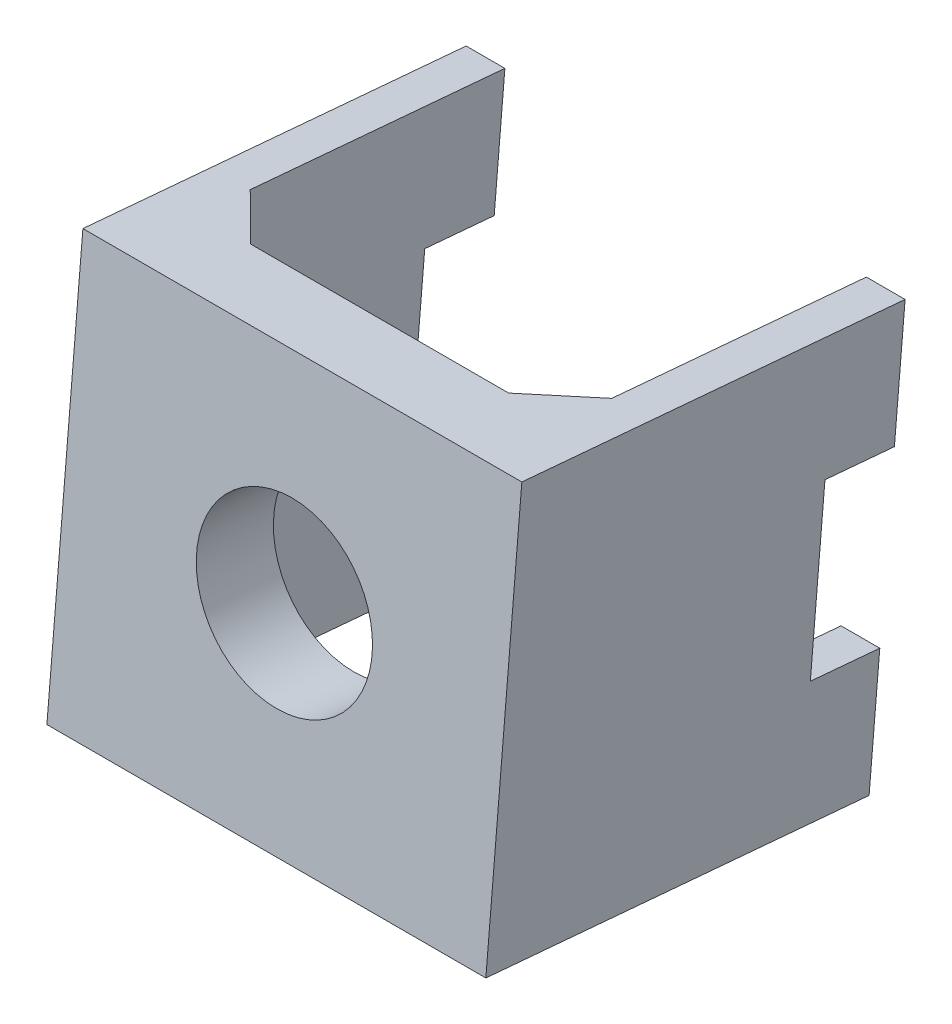
ISO-10303-21;
HEADER;
FILE_DESCRIPTION(('STEP AP214'),'2;1');
FILE_NAME('part.step','',(''),(''),'','','');
FILE_SCHEMA(('AUTOMOTIVE_DESIGN { 1 0 10303 214 1 1 1 1 }'));
ENDSEC;
DATA;
#1=APPLICATION_CONTEXT('core data for automotive mechanical design processes');
#2=APPLICATION_PROTOCOL_DEFINITION('international standard','automotive_design',2000,#1);
#3=PRODUCT_CONTEXT('',#1,'mechanical');
#4=PRODUCT('Part','Part','',(#3));
#5=PRODUCT_RELATED_PRODUCT_CATEGORY('part','',(#4));
#6=PRODUCT_DEFINITION_FORMATION('','',#4);
#7=PRODUCT_DEFINITION_CONTEXT('part definition',#1,'design');
#8=PRODUCT_DEFINITION('design','',#6,#7);
#9=PRODUCT_DEFINITION_SHAPE('','',#8);
#10=(LENGTH_UNIT() NAMED_UNIT(*) SI_UNIT(.MILLI.,.METRE.));
#11=(NAMED_UNIT(*) PLANE_ANGLE_UNIT() SI_UNIT($,.RADIAN.));
#12=(NAMED_UNIT(*) SI_UNIT($,.STERADIAN.) SOLID_ANGLE_UNIT());
#13=UNCERTAINTY_MEASURE_WITH_UNIT(LENGTH_MEASURE(1.E-05),#10,'distance_accuracy_value','');
#14=(GEOMETRIC_REPRESENTATION_CONTEXT(3) GLOBAL_UNCERTAINTY_ASSIGNED_CONTEXT((#13)) GLOBAL_UNIT_ASSIGNED_CONTEXT((#10,
#11,#12)) REPRESENTATION_CONTEXT('',''));
#15=CARTESIAN_POINT('',(0.,0.,0.));
#16=DIRECTION('',(0.,0.,1.));
#17=DIRECTION('',(1.,0.,0.));
#18=AXIS2_PLACEMENT_3D('',#15,#16,#17);
#19=CARTESIAN_POINT('',(0.,-0.771450948408242,-8.81772468932179));
#20=DIRECTION('',(0.,0.0871557427476508,0.996194698091746));
#21=DIRECTION('',(0.,-0.996194698091746,0.0871557427476508));
#22=AXIS2_PLACEMENT_3D('',#19,#20,#21);
#23=PLANE('',#22);
#24=DIRECTION('',(0.,-0.996194698091746,0.0871557427476508));
#25=VECTOR('',#24,1.);
#26=CARTESIAN_POINT('',(8.5,-50.7264702423465,-4.44722681488376));
#27=LINE('',#26,#25);
#28=CARTESIAN_POINT('',(8.5,-50.7264702423465,-4.44722681488376));
#29=VERTEX_POINT('',#28);
#30=CARTESIAN_POINT('',(8.50000000000001,-55.4583950582823,-4.03323703683242));
#31=VERTEX_POINT('',#30);
#32=EDGE_CURVE('E256',#29,#31,#27,.T.);
#33=ORIENTED_EDGE('',*,*,#32,.T.);
#34=DIRECTION('',(1.,0.,0.));
#35=VECTOR('',#34,1.);
#36=CARTESIAN_POINT('',(-16.1311755165637,-55.4583950582823,-4.03323703683242));
#37=LINE('',#36,#35);
#38=CARTESIAN_POINT('',(7.,-55.4583950582823,-4.03323703683242));
#39=VERTEX_POINT('',#38);
#40=EDGE_CURVE('E301',#39,#31,#37,.T.);
#41=ORIENTED_EDGE('',*,*,#40,.F.);
#42=DIRECTION('',(0.,-0.996194698091746,0.0871557427476507));
#43=VECTOR('',#42,1.);
#44=CARTESIAN_POINT('',(7.,-50.7264702423465,-4.44722681488377));
#45=LINE('',#44,#43);
#46=CARTESIAN_POINT('',(7.,-50.7264702423465,-4.44722681488376));
#47=VERTEX_POINT('',#46);
#48=EDGE_CURVE('E242',#47,#39,#45,.T.);
#49=ORIENTED_EDGE('',*,*,#48,.F.);
#50=DIRECTION('',(1.,0.,0.));
#51=VECTOR('',#50,1.);
#52=CARTESIAN_POINT('',(0.,-50.7264702423465,-4.44722681488376));
#53=LINE('',#52,#51);
#54=EDGE_CURVE('E259',#47,#29,#53,.T.);
#55=ORIENTED_EDGE('',*,*,#54,.T.);
#56=EDGE_LOOP('',(#33,#41,#49,#55));
#57=FACE_BOUND('',#56,.T.);
#58=ADVANCED_FACE('F43',(#57),#23,.F.);
#59=CARTESIAN_POINT('',(0.,-0.771450948408242,-8.81772468932179));
#60=DIRECTION('',(0.,0.0871557427476508,0.996194698091746));
#61=DIRECTION('',(0.,-0.996194698091746,0.0871557427476508));
#62=AXIS2_PLACEMENT_3D('',#59,#60,#61);
#63=PLANE('',#62);
#64=DIRECTION('',(0.,-0.996194698091746,0.0871557427476507));
#65=VECTOR('',#64,1.);
#66=CARTESIAN_POINT('',(-7.,-50.7264702423465,-4.44722681488377));
#67=LINE('',#66,#65);
#68=CARTESIAN_POINT('',(-7.,-50.7264702423465,-4.44722681488376));
#69=VERTEX_POINT('',#68);
#70=CARTESIAN_POINT('',(-7.,-55.4583950582823,-4.03323703683242));
#71=VERTEX_POINT('',#70);
#72=EDGE_CURVE('E201',#69,#71,#67,.T.);
#73=ORIENTED_EDGE('',*,*,#72,.T.);
#74=CARTESIAN_POINT('',(-8.50000000000001,-55.4583950582823,-4.03323703683242));
#75=VERTEX_POINT('',#74);
#76=EDGE_CURVE('E176',#75,#71,#37,.T.);
#77=ORIENTED_EDGE('',*,*,#76,.F.);
#78=DIRECTION('',(0.,-0.996194698091746,0.0871557427476508));
#79=VECTOR('',#78,1.);
#80=CARTESIAN_POINT('',(-8.5,-50.7264702423465,-4.44722681488376));
#81=LINE('',#80,#79);
#82=CARTESIAN_POINT('',(-8.5,-50.7264702423465,-4.44722681488376));
#83=VERTEX_POINT('',#82);
#84=EDGE_CURVE('E188',#83,#75,#81,.T.);
#85=ORIENTED_EDGE('',*,*,#84,.F.);
#86=DIRECTION('',(-1.,0.,0.));
#87=VECTOR('',#86,1.);
#88=CARTESIAN_POINT('',(0.,-50.7264702423465,-4.44722681488376));
#89=LINE('',#88,#87);
#90=EDGE_CURVE('E212',#69,#83,#89,.T.);
#91=ORIENTED_EDGE('',*,*,#90,.F.);
#92=EDGE_LOOP('',(#73,#77,#85,#91));
#93=FACE_BOUND('',#92,.T.);
#94=ADVANCED_FACE('F347',(#93),#63,.F.);
#95=CARTESIAN_POINT('',(0.,-52.3142448835567,-22.5955740089158));
#96=DIRECTION('',(0.,0.996194698091746,-0.0871557427476508));
#97=DIRECTION('',(0.,0.0871557427476508,0.996194698091746));
#98=AXIS2_PLACEMENT_3D('',#95,#96,#97);
#99=PLANE('',#98);
#100=DIRECTION('',(1.,0.,0.));
#101=VECTOR('',#100,1.);
#102=CARTESIAN_POINT('',(7.,-49.6893169036494,7.40749009240801));
#103=LINE('',#102,#101);
#104=CARTESIAN_POINT('',(-4.99999999999997,-49.6893169036494,7.40749009240801));
#105=VERTEX_POINT('',#104);
#106=CARTESIAN_POINT('',(4.99999999999997,-49.6893169036494,7.40749009240801));
#107=VERTEX_POINT('',#106);
#108=EDGE_CURVE('E247',#105,#107,#103,.T.);
#109=ORIENTED_EDGE('',*,*,#108,.F.);
#110=DIRECTION('',(-0.707106781186551,-0.0616284167162138,-0.704416026402755));
#111=VECTOR('',#110,1.);
#112=CARTESIAN_POINT('',(-4.99999999999997,-49.6893169036495,7.40749009240802));
#113=LINE('',#112,#111);
#114=CARTESIAN_POINT('',(-7.,-49.8636283891447,5.41510069622452));
#115=VERTEX_POINT('',#114);
#116=EDGE_CURVE('E235',#115,#105,#113,.F.);
#117=ORIENTED_EDGE('',*,*,#116,.F.);
#118=DIRECTION('',(0.,-0.0871557427476507,-0.996194698091746));
#119=VECTOR('',#118,1.);
#120=CARTESIAN_POINT('',(-7.,-47.9057400651491,27.7938666424623));
#121=LINE('',#120,#119);
#122=EDGE_CURVE('E204',#115,#69,#121,.T.);
#123=ORIENTED_EDGE('',*,*,#122,.T.);
#124=ORIENTED_EDGE('',*,*,#90,.T.);
#125=DIRECTION('',(0.,0.0871557427476508,0.996194698091746));
#126=VECTOR('',#125,1.);
#127=CARTESIAN_POINT('',(-8.5,-52.3142448835567,-22.5955740089158));
#128=LINE('',#127,#126);
#129=CARTESIAN_POINT('',(-8.5,-49.4278496754065,10.3960741866833));
#130=VERTEX_POINT('',#129);
#131=EDGE_CURVE('E220',#83,#130,#128,.T.);
#132=ORIENTED_EDGE('',*,*,#131,.T.);
#133=DIRECTION('',(-1.,0.,0.));
#134=VECTOR('',#133,1.);
#135=CARTESIAN_POINT('',(0.,-49.4278496754065,10.3960741866833));
#136=LINE('',#135,#134);
#137=CARTESIAN_POINT('',(8.5,-49.4278496754065,10.3960741866833));
#138=VERTEX_POINT('',#137);
#139=EDGE_CURVE('E268',#138,#130,#136,.T.);
#140=ORIENTED_EDGE('',*,*,#139,.F.);
#141=DIRECTION('',(0.,0.0871557427476508,0.996194698091746));
#142=VECTOR('',#141,1.);
#143=CARTESIAN_POINT('',(8.5,-52.3142448835567,-22.5955740089158));
#144=LINE('',#143,#142);
#145=EDGE_CURVE('E271',#29,#138,#144,.T.);
#146=ORIENTED_EDGE('',*,*,#145,.F.);
#147=ORIENTED_EDGE('',*,*,#54,.F.);
#148=DIRECTION('',(0.,-0.0871557427476507,-0.996194698091746));
#149=VECTOR('',#148,1.);
#150=CARTESIAN_POINT('',(7.,-47.9057400651491,27.7938666424623));
#151=LINE('',#150,#149);
#152=CARTESIAN_POINT('',(7.,-49.8636283891447,5.41510069622452));
#153=VERTEX_POINT('',#152);
#154=EDGE_CURVE('E250',#153,#47,#151,.T.);
#155=ORIENTED_EDGE('',*,*,#154,.F.);
#156=DIRECTION('',(0.707106781186551,-0.0616284167162138,-0.704416026402755));
#157=VECTOR('',#156,1.);
#158=CARTESIAN_POINT('',(4.99999999999997,-49.6893169036495,7.40749009240802));
#159=LINE('',#158,#157);
#160=EDGE_CURVE('E286',#153,#107,#159,.F.);
#161=ORIENTED_EDGE('',*,*,#160,.T.);
#162=EDGE_LOOP('',(#109,#117,#123,#124,#132,#140,#146,#147,#155,#161));
#163=FACE_BOUND('',#162,.T.);
#164=ADVANCED_FACE('F335',(#163),#99,.T.);
#165=CARTESIAN_POINT('',(8.5,-52.3142448835567,-22.5955740089158));
#166=DIRECTION('',(1.,0.,0.));
#167=DIRECTION('',(0.,1.,0.));
#168=AXIS2_PLACEMENT_3D('',#165,#166,#167);
#169=PLANE('',#168);
#170=DIRECTION('',(0.,0.0871557427476503,0.996194698091746));
#171=VECTOR('',#170,1.);
#172=CARTESIAN_POINT('',(8.5,-57.0461696994925,-22.1815842308644));
#173=LINE('',#172,#171);
#174=CARTESIAN_POINT('',(8.5,-55.2230745528637,-1.34351135198471));
#175=VERTEX_POINT('',#174);
#176=EDGE_CURVE('E193',#31,#175,#173,.T.);
#177=ORIENTED_EDGE('',*,*,#176,.F.);
#178=ORIENTED_EDGE('',*,*,#32,.F.);
#179=ORIENTED_EDGE('',*,*,#145,.T.);
#180=DIRECTION('',(0.,0.996194698091746,-0.0871557427476507));
#181=VECTOR('',#180,1.);
#182=CARTESIAN_POINT('',(8.5,-49.4278496754065,10.3960741866833));
#183=LINE('',#182,#181);
#184=CARTESIAN_POINT('',(8.50000000000001,-65.3669648448745,11.7905660706457));
#185=VERTEX_POINT('',#184);
#186=EDGE_CURVE('E265',#185,#138,#183,.T.);
#187=ORIENTED_EDGE('',*,*,#186,.F.);
#188=DIRECTION('',(0.,0.0871557427476508,0.996194698091746));
#189=VECTOR('',#188,1.);
#190=CARTESIAN_POINT('',(8.50000000000001,-68.2533600530247,-21.2010821249533));
#191=LINE('',#190,#189);
#192=CARTESIAN_POINT('',(8.50000000000001,-66.6655854118145,-3.05273493092135));
#193=VERTEX_POINT('',#192);
#194=EDGE_CURVE('E270',#193,#185,#191,.T.);
#195=ORIENTED_EDGE('',*,*,#194,.F.);
#196=CARTESIAN_POINT('',(8.5,-61.9336605958787,-3.46672470897269));
#197=VERTEX_POINT('',#196);
#198=EDGE_CURVE('E260',#197,#193,#27,.T.);
#199=ORIENTED_EDGE('',*,*,#198,.F.);
#200=DIRECTION('',(0.,-0.0871557427476503,-0.996194698091746));
#201=VECTOR('',#200,1.);
#202=CARTESIAN_POINT('',(8.50000000000001,-63.5214352370888,-21.6150719030047));
#203=LINE('',#202,#201);
#204=CARTESIAN_POINT('',(8.5,-61.69834009046,-0.776999024124979));
#205=VERTEX_POINT('',#204);
#206=EDGE_CURVE('E190',#205,#197,#203,.T.);
#207=ORIENTED_EDGE('',*,*,#206,.F.);
#208=DIRECTION('',(0.,-0.996194698091746,0.0871557427476507));
#209=VECTOR('',#208,1.);
#210=CARTESIAN_POINT('',(8.5,-50.4911497369279,-1.75750113003605));
#211=LINE('',#210,#209);
#212=EDGE_CURVE('E311',#175,#205,#211,.T.);
#213=ORIENTED_EDGE('',*,*,#212,.F.);
#214=EDGE_LOOP('',(#177,#178,#179,#187,#195,#199,#207,#213));
#215=FACE_BOUND('',#214,.T.);
#216=ADVANCED_FACE('F356',(#215),#169,.T.);
#217=CARTESIAN_POINT('',(0.,-68.2533600530247,-21.2010821249533));
#218=DIRECTION('',(0.,-0.996194698091746,0.0871557427476508));
#219=DIRECTION('',(0.,-0.0871557427476508,-0.996194698091746));
#220=AXIS2_PLACEMENT_3D('',#217,#218,#219);
#221=PLANE('',#220);
#222=DIRECTION('',(-1.,0.,0.));
#223=VECTOR('',#222,1.);
#224=CARTESIAN_POINT('',(6.99999999999999,-65.6284320731174,8.80198197637043));
#225=LINE('',#224,#223);
#226=CARTESIAN_POINT('',(4.99999999999997,-65.6284320731174,8.80198197637043));
#227=VERTEX_POINT('',#226);
#228=CARTESIAN_POINT('',(-4.99999999999997,-65.6284320731174,8.80198197637043));
#229=VERTEX_POINT('',#228);
#230=EDGE_CURVE('E245',#227,#229,#225,.T.);
#231=ORIENTED_EDGE('',*,*,#230,.F.);
#232=DIRECTION('',(-0.707106781186551,0.0616284167162138,0.704416026402755));
#233=VECTOR('',#232,1.);
#234=CARTESIAN_POINT('',(4.99999999999997,-65.6284320731174,8.80198197637043));
#235=LINE('',#234,#233);
#236=CARTESIAN_POINT('',(6.99999999999999,-65.8027435586127,6.80959258018694));
#237=VERTEX_POINT('',#236);
#238=EDGE_CURVE('E284',#227,#237,#235,.F.);
#239=ORIENTED_EDGE('',*,*,#238,.T.);
#240=DIRECTION('',(0.,-0.0871557427476507,-0.996194698091746));
#241=VECTOR('',#240,1.);
#242=CARTESIAN_POINT('',(6.99999999999999,-63.8448552346171,29.1883585264247));
#243=LINE('',#242,#241);
#244=CARTESIAN_POINT('',(6.99999999999999,-66.6655854118144,-3.05273493092136));
#245=VERTEX_POINT('',#244);
#246=EDGE_CURVE('E252',#237,#245,#243,.T.);
#247=ORIENTED_EDGE('',*,*,#246,.T.);
#248=DIRECTION('',(-1.,0.,0.));
#249=VECTOR('',#248,1.);
#250=CARTESIAN_POINT('',(0.,-66.6655854118145,-3.05273493092135));
#251=LINE('',#250,#249);
#252=EDGE_CURVE('E262',#193,#245,#251,.T.);
#253=ORIENTED_EDGE('',*,*,#252,.F.);
#254=ORIENTED_EDGE('',*,*,#194,.T.);
#255=DIRECTION('',(1.,0.,0.));
#256=VECTOR('',#255,1.);
#257=CARTESIAN_POINT('',(0.,-65.3669648448745,11.7905660706457));
#258=LINE('',#257,#256);
#259=CARTESIAN_POINT('',(-8.50000000000001,-65.3669648448745,11.7905660706457));
#260=VERTEX_POINT('',#259);
#261=EDGE_CURVE('E255',#260,#185,#258,.T.);
#262=ORIENTED_EDGE('',*,*,#261,.F.);
#263=DIRECTION('',(0.,0.0871557427476508,0.996194698091746));
#264=VECTOR('',#263,1.);
#265=CARTESIAN_POINT('',(-8.50000000000001,-68.2533600530247,-21.2010821249533));
#266=LINE('',#265,#264);
#267=CARTESIAN_POINT('',(-8.50000000000001,-66.6655854118145,-3.05273493092135));
#268=VERTEX_POINT('',#267);
#269=EDGE_CURVE('E219',#268,#260,#266,.T.);
#270=ORIENTED_EDGE('',*,*,#269,.F.);
#271=DIRECTION('',(1.,0.,0.));
#272=VECTOR('',#271,1.);
#273=CARTESIAN_POINT('',(0.,-66.6655854118145,-3.05273493092135));
#274=LINE('',#273,#272);
#275=CARTESIAN_POINT('',(-6.99999999999999,-66.6655854118144,-3.05273493092136));
#276=VERTEX_POINT('',#275);
#277=EDGE_CURVE('E216',#268,#276,#274,.T.);
#278=ORIENTED_EDGE('',*,*,#277,.T.);
#279=DIRECTION('',(0.,-0.0871557427476507,-0.996194698091746));
#280=VECTOR('',#279,1.);
#281=CARTESIAN_POINT('',(-6.99999999999999,-63.8448552346171,29.1883585264247));
#282=LINE('',#281,#280);
#283=CARTESIAN_POINT('',(-6.99999999999999,-65.8027435586127,6.80959258018694));
#284=VERTEX_POINT('',#283);
#285=EDGE_CURVE('E207',#284,#276,#282,.T.);
#286=ORIENTED_EDGE('',*,*,#285,.F.);
#287=DIRECTION('',(0.707106781186551,0.0616284167162138,0.704416026402755));
#288=VECTOR('',#287,1.);
#289=CARTESIAN_POINT('',(-4.99999999999997,-65.6284320731174,8.80198197637043));
#290=LINE('',#289,#288);
#291=EDGE_CURVE('E232',#229,#284,#290,.F.);
#292=ORIENTED_EDGE('',*,*,#291,.F.);
#293=EDGE_LOOP('',(#231,#239,#247,#253,#254,#262,#270,#278,#286,#292));
#294=FACE_BOUND('',#293,.T.);
#295=ADVANCED_FACE('F327',(#294),#221,.T.);
#296=CARTESIAN_POINT('',(0.,0.527169618531755,6.02557631224522));
#297=DIRECTION('',(0.,0.0871557427476507,0.996194698091746));
#298=DIRECTION('',(0.,-0.996194698091746,0.0871557427476507));
#299=AXIS2_PLACEMENT_3D('',#296,#297,#298);
#300=PLANE('',#299);
#301=DIRECTION('',(0.,0.996194698091746,-0.0871557427476507));
#302=VECTOR('',#301,1.);
#303=CARTESIAN_POINT('',(-8.5,-49.4278496754065,10.3960741866833));
#304=LINE('',#303,#302);
#305=EDGE_CURVE('E210',#260,#130,#304,.T.);
#306=ORIENTED_EDGE('',*,*,#305,.F.);
#307=ORIENTED_EDGE('',*,*,#261,.T.);
#308=ORIENTED_EDGE('',*,*,#186,.T.);
#309=ORIENTED_EDGE('',*,*,#139,.T.);
#310=EDGE_LOOP('',(#306,#307,#308,#309));
#311=FACE_BOUND('',#310,.T.);
#312=CARTESIAN_POINT('',(0.,-57.3974072601404,11.0933201286645));
#313=DIRECTION('',(0.,0.0871557427476508,0.996194698091746));
#314=DIRECTION('',(0.,-0.996194698091746,0.0871557427476508));
#315=AXIS2_PLACEMENT_3D('',#312,#313,#314);
#316=CIRCLE('',#315,3.4);
#317=CARTESIAN_POINT('',(0.,-60.7844692336524,11.3896496540065));
#318=VERTEX_POINT('',#317);
#319=EDGE_CURVE('E238',#318,#318,#316,.T.);
#320=ORIENTED_EDGE('',*,*,#319,.F.);
#321=EDGE_LOOP('',(#320));
#322=FACE_BOUND('',#321,.T.);
#323=ADVANCED_FACE('F352',(#311,#322),#300,.T.);
#324=CARTESIAN_POINT('',(7.,-61.9336605958787,-3.46672470897269));
#325=VERTEX_POINT('',#324);
#326=EDGE_CURVE('E241',#325,#245,#45,.T.);
#327=ORIENTED_EDGE('',*,*,#326,.F.);
#328=DIRECTION('',(1.,0.,0.));
#329=VECTOR('',#328,1.);
#330=CARTESIAN_POINT('',(-16.1311755165637,-61.9336605958787,-3.46672470897269));
#331=LINE('',#330,#329);
#332=EDGE_CURVE('E302',#325,#197,#331,.T.);
#333=ORIENTED_EDGE('',*,*,#332,.T.);
#334=ORIENTED_EDGE('',*,*,#198,.T.);
#335=ORIENTED_EDGE('',*,*,#252,.T.);
#336=EDGE_LOOP('',(#327,#333,#334,#335));
#337=FACE_BOUND('',#336,.T.);
#338=ADVANCED_FACE('F321',(#337),#23,.F.);
#339=CARTESIAN_POINT('',(0.,0.265702390288803,3.03699221796999));
#340=DIRECTION('',(0.,0.0871557427476507,0.996194698091746));
#341=DIRECTION('',(0.,-0.996194698091746,0.0871557427476507));
#342=AXIS2_PLACEMENT_3D('',#339,#340,#341);
#343=PLANE('',#342);
#344=CARTESIAN_POINT('',(0.,-57.6588744883834,8.10473603438922));
#345=DIRECTION('',(0.,0.0871557427476507,0.996194698091746));
#346=DIRECTION('',(0.,-0.996194698091746,0.0871557427476507));
#347=AXIS2_PLACEMENT_3D('',#344,#345,#346);
#348=CIRCLE('',#347,3.4);
#349=CARTESIAN_POINT('',(0.,-61.0459364618953,8.40106555973123));
#350=VERTEX_POINT('',#349);
#351=EDGE_CURVE('E276',#350,#350,#348,.T.);
#352=ORIENTED_EDGE('',*,*,#351,.T.);
#353=EDGE_LOOP('',(#352));
#354=FACE_BOUND('',#353,.T.);
#355=ORIENTED_EDGE('',*,*,#108,.T.);
#356=DIRECTION('',(0.,-0.996194698091746,0.0871557427476507));
#357=VECTOR('',#356,1.);
#358=CARTESIAN_POINT('',(4.99999999999997,-65.6284320731174,8.80198197637043));
#359=LINE('',#358,#357);
#360=EDGE_CURVE('E279',#107,#227,#359,.T.);
#361=ORIENTED_EDGE('',*,*,#360,.T.);
#362=ORIENTED_EDGE('',*,*,#230,.T.);
#363=DIRECTION('',(0.,-0.996194698091746,0.0871557427476507));
#364=VECTOR('',#363,1.);
#365=CARTESIAN_POINT('',(-4.99999999999997,-65.6284320731174,8.80198197637043));
#366=LINE('',#365,#364);
#367=EDGE_CURVE('E227',#105,#229,#366,.T.);
#368=ORIENTED_EDGE('',*,*,#367,.F.);
#369=EDGE_LOOP('',(#355,#361,#362,#368));
#370=FACE_BOUND('',#369,.T.);
#371=ADVANCED_FACE('F340',(#354,#370),#343,.F.);
#372=CARTESIAN_POINT('',(7.,-47.9057400651491,27.7938666424623));
#373=DIRECTION('',(1.,0.,0.));
#374=DIRECTION('',(0.,1.,0.));
#375=AXIS2_PLACEMENT_3D('',#372,#373,#374);
#376=PLANE('',#375);
#377=ORIENTED_EDGE('',*,*,#48,.T.);
#378=DIRECTION('',(0.,0.0871557427476503,0.996194698091746));
#379=VECTOR('',#378,1.);
#380=CARTESIAN_POINT('',(7.,-52.637664881085,28.2078564205136));
#381=LINE('',#380,#379);
#382=CARTESIAN_POINT('',(7.,-55.2230745528637,-1.34351135198471));
#383=VERTEX_POINT('',#382);
#384=EDGE_CURVE('E189',#39,#383,#381,.T.);
#385=ORIENTED_EDGE('',*,*,#384,.T.);
#386=DIRECTION('',(0.,-0.996194698091746,0.0871557427476507));
#387=VECTOR('',#386,1.);
#388=CARTESIAN_POINT('',(7.,-50.4911497369278,-1.75750113003605));
#389=LINE('',#388,#387);
#390=CARTESIAN_POINT('',(7.,-61.69834009046,-0.776999024124979));
#391=VERTEX_POINT('',#390);
#392=EDGE_CURVE('E175',#383,#391,#389,.T.);
#393=ORIENTED_EDGE('',*,*,#392,.T.);
#394=DIRECTION('',(0.,-0.0871557427476503,-0.996194698091746));
#395=VECTOR('',#394,1.);
#396=CARTESIAN_POINT('',(7.,-59.1129304186813,28.7743687483734));
#397=LINE('',#396,#395);
#398=EDGE_CURVE('E195',#391,#325,#397,.T.);
#399=ORIENTED_EDGE('',*,*,#398,.T.);
#400=ORIENTED_EDGE('',*,*,#326,.T.);
#401=ORIENTED_EDGE('',*,*,#246,.F.);
#402=DIRECTION('',(0.,0.996194698091746,-0.0871557427476507));
#403=VECTOR('',#402,1.);
#404=CARTESIAN_POINT('',(7.,-49.8636283891447,5.41510069622452));
#405=LINE('',#404,#403);
#406=EDGE_CURVE('E282',#237,#153,#405,.T.);
#407=ORIENTED_EDGE('',*,*,#406,.T.);
#408=ORIENTED_EDGE('',*,*,#154,.T.);
#409=EDGE_LOOP('',(#377,#385,#393,#399,#400,#401,#407,#408));
#410=FACE_BOUND('',#409,.T.);
#411=ADVANCED_FACE('F317',(#410),#376,.F.);
#412=CARTESIAN_POINT('',(0.,-62.8490618065024,-51.2193764728454));
#413=DIRECTION('',(0.,0.0871557427476508,0.996194698091746));
#414=DIRECTION('',(0.,-0.996194698091746,0.0871557427476508));
#415=AXIS2_PLACEMENT_3D('',#412,#413,#414);
#416=CYLINDRICAL_SURFACE('',#415,3.4);
#417=ORIENTED_EDGE('',*,*,#319,.T.);
#418=EDGE_LOOP('',(#417));
#419=FACE_BOUND('',#418,.T.);
#420=ORIENTED_EDGE('',*,*,#351,.F.);
#421=EDGE_LOOP('',(#420));
#422=FACE_BOUND('',#421,.T.);
#423=ADVANCED_FACE('F506',(#419,#422),#416,.F.);
#424=CARTESIAN_POINT('',(4.99999999999998,0.265702390288802,3.03699221796999));
#425=DIRECTION('',(-0.707106781186544,-0.0616284167162143,-0.704416026402763));
#426=DIRECTION('',(0.,0.996194698091746,-0.0871557427476507));
#427=AXIS2_PLACEMENT_3D('',#424,#425,#426);
#428=PLANE('',#427);
#429=ORIENTED_EDGE('',*,*,#160,.F.);
#430=ORIENTED_EDGE('',*,*,#406,.F.);
#431=ORIENTED_EDGE('',*,*,#238,.F.);
#432=ORIENTED_EDGE('',*,*,#360,.F.);
#433=EDGE_LOOP('',(#429,#430,#431,#432));
#434=FACE_BOUND('',#433,.T.);
#435=ADVANCED_FACE('F46',(#434),#428,.T.);
#436=CARTESIAN_POINT('',(-8.5,-52.3142448835567,-22.5955740089158));
#437=DIRECTION('',(-1.,0.,0.));
#438=DIRECTION('',(0.,1.,0.));
#439=AXIS2_PLACEMENT_3D('',#436,#437,#438);
#440=PLANE('',#439);
#441=DIRECTION('',(0.,-0.0871557427476503,-0.996194698091746));
#442=VECTOR('',#441,1.);
#443=CARTESIAN_POINT('',(-8.5,-57.0461696994925,-22.1815842308644));
#444=LINE('',#443,#442);
#445=CARTESIAN_POINT('',(-8.5,-55.2230745528637,-1.34351135198471));
#446=VERTEX_POINT('',#445);
#447=EDGE_CURVE('E180',#446,#75,#444,.T.);
#448=ORIENTED_EDGE('',*,*,#447,.F.);
#449=DIRECTION('',(0.,0.996194698091746,-0.0871557427476507));
#450=VECTOR('',#449,1.);
#451=CARTESIAN_POINT('',(-8.5,-50.4911497369279,-1.75750113003605));
#452=LINE('',#451,#450);
#453=CARTESIAN_POINT('',(-8.5,-61.69834009046,-0.776999024124979));
#454=VERTEX_POINT('',#453);
#455=EDGE_CURVE('E168',#454,#446,#452,.T.);
#456=ORIENTED_EDGE('',*,*,#455,.F.);
#457=DIRECTION('',(0.,0.0871557427476503,0.996194698091746));
#458=VECTOR('',#457,1.);
#459=CARTESIAN_POINT('',(-8.50000000000001,-63.5214352370888,-21.6150719030047));
#460=LINE('',#459,#458);
#461=CARTESIAN_POINT('',(-8.50000000000001,-61.9336605958787,-3.46672470897269));
#462=VERTEX_POINT('',#461);
#463=EDGE_CURVE('E313',#462,#454,#460,.T.);
#464=ORIENTED_EDGE('',*,*,#463,.F.);
#465=EDGE_CURVE('E213',#462,#268,#81,.T.);
#466=ORIENTED_EDGE('',*,*,#465,.T.);
#467=ORIENTED_EDGE('',*,*,#269,.T.);
#468=ORIENTED_EDGE('',*,*,#305,.T.);
#469=ORIENTED_EDGE('',*,*,#131,.F.);
#470=ORIENTED_EDGE('',*,*,#84,.T.);
#471=EDGE_LOOP('',(#448,#456,#464,#466,#467,#468,#469,#470));
#472=FACE_BOUND('',#471,.T.);
#473=ADVANCED_FACE('F186',(#472),#440,.T.);
#474=ORIENTED_EDGE('',*,*,#465,.F.);
#475=CARTESIAN_POINT('',(-7.,-61.9336605958787,-3.46672470897269));
#476=VERTEX_POINT('',#475);
#477=EDGE_CURVE('E296',#462,#476,#331,.T.);
#478=ORIENTED_EDGE('',*,*,#477,.T.);
#479=EDGE_CURVE('E200',#476,#276,#67,.T.);
#480=ORIENTED_EDGE('',*,*,#479,.T.);
#481=ORIENTED_EDGE('',*,*,#277,.F.);
#482=EDGE_LOOP('',(#474,#478,#480,#481));
#483=FACE_BOUND('',#482,.T.);
#484=ADVANCED_FACE('F299',(#483),#63,.F.);
#485=CARTESIAN_POINT('',(-7.,-47.9057400651491,27.7938666424623));
#486=DIRECTION('',(-1.,0.,0.));
#487=DIRECTION('',(0.,1.,0.));
#488=AXIS2_PLACEMENT_3D('',#485,#486,#487);
#489=PLANE('',#488);
#490=DIRECTION('',(0.,0.996194698091746,-0.0871557427476507));
#491=VECTOR('',#490,1.);
#492=CARTESIAN_POINT('',(-7.,-50.4911497369278,-1.75750113003605));
#493=LINE('',#492,#491);
#494=CARTESIAN_POINT('',(-7.,-61.69834009046,-0.776999024124979));
#495=VERTEX_POINT('',#494);
#496=CARTESIAN_POINT('',(-7.,-55.2230745528637,-1.34351135198471));
#497=VERTEX_POINT('',#496);
#498=EDGE_CURVE('E288',#495,#497,#493,.T.);
#499=ORIENTED_EDGE('',*,*,#498,.T.);
#500=DIRECTION('',(0.,-0.0871557427476503,-0.996194698091746));
#501=VECTOR('',#500,1.);
#502=CARTESIAN_POINT('',(-7.,-52.637664881085,28.2078564205136));
#503=LINE('',#502,#501);
#504=EDGE_CURVE('E12',#497,#71,#503,.T.);
#505=ORIENTED_EDGE('',*,*,#504,.T.);
#506=ORIENTED_EDGE('',*,*,#72,.F.);
#507=ORIENTED_EDGE('',*,*,#122,.F.);
#508=DIRECTION('',(0.,0.996194698091746,-0.0871557427476507));
#509=VECTOR('',#508,1.);
#510=CARTESIAN_POINT('',(-7.,-49.8636283891447,5.41510069622452));
#511=LINE('',#510,#509);
#512=EDGE_CURVE('E230',#284,#115,#511,.T.);
#513=ORIENTED_EDGE('',*,*,#512,.F.);
#514=ORIENTED_EDGE('',*,*,#285,.T.);
#515=ORIENTED_EDGE('',*,*,#479,.F.);
#516=DIRECTION('',(0.,0.0871557427476503,0.996194698091746));
#517=VECTOR('',#516,1.);
#518=CARTESIAN_POINT('',(-7.,-59.1129304186813,28.7743687483734));
#519=LINE('',#518,#517);
#520=EDGE_CURVE('E52',#476,#495,#519,.T.);
#521=ORIENTED_EDGE('',*,*,#520,.T.);
#522=EDGE_LOOP('',(#499,#505,#506,#507,#513,#514,#515,#521));
#523=FACE_BOUND('',#522,.T.);
#524=ADVANCED_FACE('F292',(#523),#489,.F.);
#525=CARTESIAN_POINT('',(-4.99999999999998,0.265702390288802,3.03699221796999));
#526=DIRECTION('',(0.707106781186544,-0.0616284167162143,-0.704416026402763));
#527=DIRECTION('',(0.,0.996194698091746,-0.0871557427476507));
#528=AXIS2_PLACEMENT_3D('',#525,#526,#527);
#529=PLANE('',#528);
#530=ORIENTED_EDGE('',*,*,#116,.T.);
#531=ORIENTED_EDGE('',*,*,#367,.T.);
#532=ORIENTED_EDGE('',*,*,#291,.T.);
#533=ORIENTED_EDGE('',*,*,#512,.T.);
#534=EDGE_LOOP('',(#530,#531,#532,#533));
#535=FACE_BOUND('',#534,.T.);
#536=ADVANCED_FACE('F343',(#535),#529,.T.);
#537=CARTESIAN_POINT('',(-16.1311755165637,-55.2230745528637,-1.34351135198471));
#538=DIRECTION('',(0.,0.0871557427476507,0.996194698091746));
#539=DIRECTION('',(0.,-0.996194698091746,0.0871557427476507));
#540=AXIS2_PLACEMENT_3D('',#537,#538,#539);
#541=PLANE('',#540);
#542=ORIENTED_EDGE('',*,*,#455,.T.);
#543=DIRECTION('',(1.,0.,0.));
#544=VECTOR('',#543,1.);
#545=CARTESIAN_POINT('',(-16.1311755165637,-55.2230745528637,-1.34351135198471));
#546=LINE('',#545,#544);
#547=EDGE_CURVE('E67',#446,#497,#546,.T.);
#548=ORIENTED_EDGE('',*,*,#547,.T.);
#549=ORIENTED_EDGE('',*,*,#498,.F.);
#550=DIRECTION('',(1.,0.,0.));
#551=VECTOR('',#550,1.);
#552=CARTESIAN_POINT('',(-16.1311755165637,-61.69834009046,-0.776999024124979));
#553=LINE('',#552,#551);
#554=EDGE_CURVE('E171',#454,#495,#553,.T.);
#555=ORIENTED_EDGE('',*,*,#554,.F.);
#556=EDGE_LOOP('',(#542,#548,#549,#555));
#557=FACE_BOUND('',#556,.T.);
#558=ADVANCED_FACE('F169',(#557),#541,.F.);
#559=CARTESIAN_POINT('',(-16.1311755165637,-61.69834009046,-0.776999024124979));
#560=DIRECTION('',(0.,-0.996194698091746,0.0871557427476503));
#561=DIRECTION('',(0.,-0.0871557427476503,-0.996194698091746));
#562=AXIS2_PLACEMENT_3D('',#559,#560,#561);
#563=PLANE('',#562);
#564=ORIENTED_EDGE('',*,*,#463,.T.);
#565=ORIENTED_EDGE('',*,*,#554,.T.);
#566=ORIENTED_EDGE('',*,*,#520,.F.);
#567=ORIENTED_EDGE('',*,*,#477,.F.);
#568=EDGE_LOOP('',(#564,#565,#566,#567));
#569=FACE_BOUND('',#568,.T.);
#570=ADVANCED_FACE('F295',(#569),#563,.F.);
#571=CARTESIAN_POINT('',(-16.1311755165637,-55.4583950582823,-4.03323703683242));
#572=DIRECTION('',(0.,0.996194698091746,-0.0871557427476503));
#573=DIRECTION('',(0.,0.0871557427476503,0.996194698091746));
#574=AXIS2_PLACEMENT_3D('',#571,#572,#573);
#575=PLANE('',#574);
#576=ORIENTED_EDGE('',*,*,#447,.T.);
#577=ORIENTED_EDGE('',*,*,#76,.T.);
#578=ORIENTED_EDGE('',*,*,#504,.F.);
#579=ORIENTED_EDGE('',*,*,#547,.F.);
#580=EDGE_LOOP('',(#576,#577,#578,#579));
#581=FACE_BOUND('',#580,.T.);
#582=ADVANCED_FACE('F179',(#581),#575,.F.);
#583=ORIENTED_EDGE('',*,*,#176,.T.);
#584=EDGE_CURVE('E183',#383,#175,#546,.T.);
#585=ORIENTED_EDGE('',*,*,#584,.F.);
#586=ORIENTED_EDGE('',*,*,#384,.F.);
#587=ORIENTED_EDGE('',*,*,#40,.T.);
#588=EDGE_LOOP('',(#583,#585,#586,#587));
#589=FACE_BOUND('',#588,.T.);
#590=ADVANCED_FACE('F364',(#589),#575,.F.);
#591=ORIENTED_EDGE('',*,*,#206,.T.);
#592=ORIENTED_EDGE('',*,*,#332,.F.);
#593=ORIENTED_EDGE('',*,*,#398,.F.);
#594=EDGE_CURVE('E59',#391,#205,#553,.T.);
#595=ORIENTED_EDGE('',*,*,#594,.T.);
#596=EDGE_LOOP('',(#591,#592,#593,#595));
#597=FACE_BOUND('',#596,.T.);
#598=ADVANCED_FACE('F367',(#597),#563,.F.);
#599=ORIENTED_EDGE('',*,*,#212,.T.);
#600=ORIENTED_EDGE('',*,*,#594,.F.);
#601=ORIENTED_EDGE('',*,*,#392,.F.);
#602=ORIENTED_EDGE('',*,*,#584,.T.);
#603=EDGE_LOOP('',(#599,#600,#601,#602));
#604=FACE_BOUND('',#603,.T.);
#605=ADVANCED_FACE('F365',(#604),#541,.F.);
#606=CLOSED_SHELL('',(#58,#94,#164,#216,#295,#323,#338,#371,#411,#423,#435,#473,#484,#524,#536,
#558,#570,#582,#590,#598,#605));
#607=MANIFOLD_SOLID_BREP('B2',#606);
#608=ADVANCED_BREP_SHAPE_REPRESENTATION('',(#18,#607),#14);
#609=SHAPE_DEFINITION_REPRESENTATION(#9,#608);
ENDSEC;
END-ISO-10303-21;
